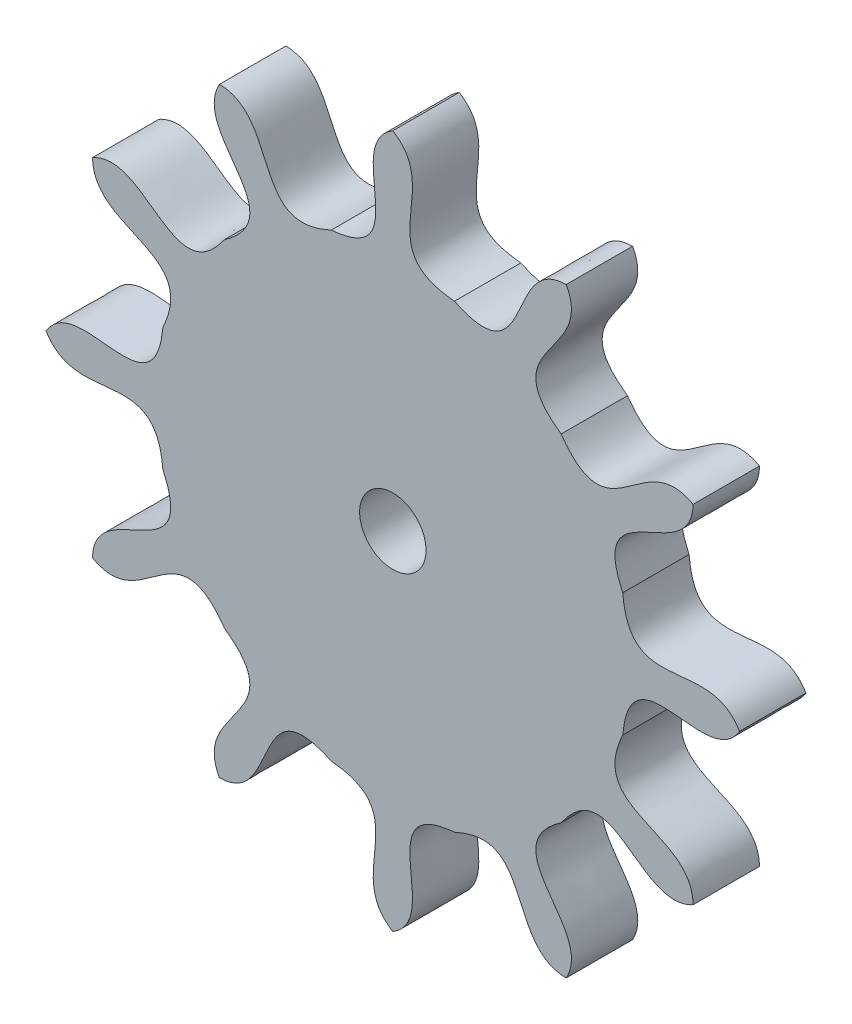
ISO-10303-21;
HEADER;
FILE_DESCRIPTION(('STEP AP214'),'2;1');
FILE_NAME('part.step','',(''),(''),'','','');
FILE_SCHEMA(('AUTOMOTIVE_DESIGN { 1 0 10303 214 1 1 1 1 }'));
ENDSEC;
DATA;
#1=APPLICATION_CONTEXT('core data for automotive mechanical design processes');
#2=APPLICATION_PROTOCOL_DEFINITION('international standard','automotive_design',2000,#1);
#3=PRODUCT_CONTEXT('',#1,'mechanical');
#4=PRODUCT('Part','Part','',(#3));
#5=PRODUCT_RELATED_PRODUCT_CATEGORY('part','',(#4));
#6=PRODUCT_DEFINITION_FORMATION('','',#4);
#7=PRODUCT_DEFINITION_CONTEXT('part definition',#1,'design');
#8=PRODUCT_DEFINITION('design','',#6,#7);
#9=PRODUCT_DEFINITION_SHAPE('','',#8);
#10=(LENGTH_UNIT() NAMED_UNIT(*) SI_UNIT(.MILLI.,.METRE.));
#11=(NAMED_UNIT(*) PLANE_ANGLE_UNIT() SI_UNIT($,.RADIAN.));
#12=(NAMED_UNIT(*) SI_UNIT($,.STERADIAN.) SOLID_ANGLE_UNIT());
#13=UNCERTAINTY_MEASURE_WITH_UNIT(LENGTH_MEASURE(1.E-05),#10,'distance_accuracy_value','');
#14=(GEOMETRIC_REPRESENTATION_CONTEXT(3) GLOBAL_UNCERTAINTY_ASSIGNED_CONTEXT((#13)) GLOBAL_UNIT_ASSIGNED_CONTEXT((#10,
#11,#12)) REPRESENTATION_CONTEXT('',''));
#15=CARTESIAN_POINT('',(0.,0.,0.));
#16=DIRECTION('',(0.,0.,1.));
#17=DIRECTION('',(1.,0.,0.));
#18=AXIS2_PLACEMENT_3D('',#15,#16,#17);
#19=CARTESIAN_POINT('',(0.,26.1243556529821,5.));
#20=CARTESIAN_POINT('',(-3.88486427358941,23.7885822212176,5.));
#21=CARTESIAN_POINT('',(1.91252387629169,17.9039035924904,5.));
#22=CARTESIAN_POINT('',(-4.64125631665174,17.3214043846944,5.));
#23=B_SPLINE_CURVE_WITH_KNOTS('',3,(#19,#20,#21,#22),.UNSPECIFIED.,.F.,.F.,(4,4),(0.,1.),.UNSPECIFIED.);
#24=DIRECTION('',(0.,0.,-1.));
#25=VECTOR('',#24,1.);
#26=SURFACE_OF_LINEAR_EXTRUSION('',#23,#25);
#27=CARTESIAN_POINT('',(0.,26.1243556529821,0.));
#28=CARTESIAN_POINT('',(-3.88486427358941,23.7885822212176,0.));
#29=CARTESIAN_POINT('',(1.91252387629169,17.9039035924904,0.));
#30=CARTESIAN_POINT('',(-4.64125631665174,17.3214043846944,0.));
#31=B_SPLINE_CURVE_WITH_KNOTS('',3,(#27,#28,#29,#30),.UNSPECIFIED.,.F.,.F.,(4,4),(0.,1.),.UNSPECIFIED.);
#32=CARTESIAN_POINT('',(0.,26.1243556529821,0.));
#33=VERTEX_POINT('',#32);
#34=CARTESIAN_POINT('',(-4.64125631665174,17.3214043846944,0.));
#35=VERTEX_POINT('',#34);
#36=EDGE_CURVE('E468',#33,#35,#31,.T.);
#37=ORIENTED_EDGE('',*,*,#36,.T.);
#38=DIRECTION('',(0.,0.,-1.));
#39=VECTOR('',#38,1.);
#40=CARTESIAN_POINT('',(-4.64125631665174,17.3214043846944,5.));
#41=LINE('',#40,#39);
#42=CARTESIAN_POINT('',(-4.64125631665174,17.3214043846944,5.));
#43=VERTEX_POINT('',#42);
#44=EDGE_CURVE('E11',#43,#35,#41,.T.);
#45=ORIENTED_EDGE('',*,*,#44,.F.);
#46=CARTESIAN_POINT('',(0.,26.1243556529821,5.));
#47=VERTEX_POINT('',#46);
#48=EDGE_CURVE('E626',#47,#43,#23,.T.);
#49=ORIENTED_EDGE('',*,*,#48,.F.);
#50=DIRECTION('',(0.,0.,-1.));
#51=VECTOR('',#50,1.);
#52=CARTESIAN_POINT('',(0.,26.1243556529821,5.));
#53=LINE('',#52,#51);
#54=EDGE_CURVE('E222',#47,#33,#53,.T.);
#55=ORIENTED_EDGE('',*,*,#54,.T.);
#56=EDGE_LOOP('',(#37,#45,#49,#55));
#57=FACE_BOUND('',#56,.T.);
#58=ADVANCED_FACE('F33',(#57),#26,.F.);
#59=CARTESIAN_POINT('',(-4.64125631665174,17.3214043846944,5.));
#60=CARTESIAN_POINT('',(-10.6082460584579,14.5489733998586,5.));
#61=CARTESIAN_POINT('',(-8.52989995942556,22.5439486603841,5.));
#62=CARTESIAN_POINT('',(-13.0621778264908,22.6243556529823,5.));
#63=B_SPLINE_CURVE_WITH_KNOTS('',3,(#59,#60,#61,#62),.UNSPECIFIED.,.F.,.F.,(4,4),(0.,1.),.UNSPECIFIED.);
#64=DIRECTION('',(0.,0.,-1.));
#65=VECTOR('',#64,1.);
#66=SURFACE_OF_LINEAR_EXTRUSION('',#63,#65);
#67=CARTESIAN_POINT('',(-4.64125631665174,17.3214043846944,0.));
#68=CARTESIAN_POINT('',(-10.6082460584579,14.5489733998586,0.));
#69=CARTESIAN_POINT('',(-8.52989995942556,22.5439486603841,0.));
#70=CARTESIAN_POINT('',(-13.0621778264908,22.6243556529823,0.));
#71=B_SPLINE_CURVE_WITH_KNOTS('',3,(#67,#68,#69,#70),.UNSPECIFIED.,.F.,.F.,(4,4),(0.,1.),.UNSPECIFIED.);
#72=CARTESIAN_POINT('',(-13.0621778264908,22.6243556529823,0.));
#73=VERTEX_POINT('',#72);
#74=EDGE_CURVE('E459',#35,#73,#71,.T.);
#75=ORIENTED_EDGE('',*,*,#74,.T.);
#76=DIRECTION('',(0.,0.,-1.));
#77=VECTOR('',#76,1.);
#78=CARTESIAN_POINT('',(-13.0621778264908,22.6243556529823,5.));
#79=LINE('',#78,#77);
#80=CARTESIAN_POINT('',(-13.0621778264908,22.6243556529823,5.));
#81=VERTEX_POINT('',#80);
#82=EDGE_CURVE('E42',#81,#73,#79,.T.);
#83=ORIENTED_EDGE('',*,*,#82,.F.);
#84=EDGE_CURVE('E141',#43,#81,#63,.T.);
#85=ORIENTED_EDGE('',*,*,#84,.F.);
#86=ORIENTED_EDGE('',*,*,#44,.T.);
#87=EDGE_LOOP('',(#75,#83,#85,#86));
#88=FACE_BOUND('',#87,.T.);
#89=ADVANCED_FACE('F452',(#88),#66,.F.);
#90=CARTESIAN_POINT('',(-13.0621778264908,22.6243556529823,5.));
#91=CARTESIAN_POINT('',(-15.2586822617916,18.6590843867948,5.));
#92=CARTESIAN_POINT('',(-7.29565753403201,16.46149727615,5.));
#93=CARTESIAN_POINT('',(-12.6801480680425,12.6801480680427,5.));
#94=B_SPLINE_CURVE_WITH_KNOTS('',3,(#90,#91,#92,#93),.UNSPECIFIED.,.F.,.F.,(4,4),(0.,1.),.UNSPECIFIED.);
#95=DIRECTION('',(0.,0.,-1.));
#96=VECTOR('',#95,1.);
#97=SURFACE_OF_LINEAR_EXTRUSION('',#94,#96);
#98=CARTESIAN_POINT('',(-13.0621778264908,22.6243556529823,0.));
#99=CARTESIAN_POINT('',(-15.2586822617916,18.6590843867948,0.));
#100=CARTESIAN_POINT('',(-7.29565753403201,16.46149727615,0.));
#101=CARTESIAN_POINT('',(-12.6801480680425,12.6801480680427,0.));
#102=B_SPLINE_CURVE_WITH_KNOTS('',3,(#98,#99,#100,#101),.UNSPECIFIED.,.F.,.F.,(4,4),(0.,1.),.UNSPECIFIED.);
#103=CARTESIAN_POINT('',(-12.6801480680425,12.6801480680427,0.));
#104=VERTEX_POINT('',#103);
#105=EDGE_CURVE('E467',#73,#104,#102,.T.);
#106=ORIENTED_EDGE('',*,*,#105,.T.);
#107=DIRECTION('',(0.,0.,-1.));
#108=VECTOR('',#107,1.);
#109=CARTESIAN_POINT('',(-12.6801480680425,12.6801480680427,5.));
#110=LINE('',#109,#108);
#111=CARTESIAN_POINT('',(-12.6801480680425,12.6801480680427,5.));
#112=VERTEX_POINT('',#111);
#113=EDGE_CURVE('E472',#112,#104,#110,.T.);
#114=ORIENTED_EDGE('',*,*,#113,.F.);
#115=EDGE_CURVE('E436',#81,#112,#94,.T.);
#116=ORIENTED_EDGE('',*,*,#115,.F.);
#117=ORIENTED_EDGE('',*,*,#82,.T.);
#118=EDGE_LOOP('',(#106,#114,#116,#117));
#119=FACE_BOUND('',#118,.T.);
#120=ADVANCED_FACE('F450',(#119),#97,.F.);
#121=CARTESIAN_POINT('',(-12.6801480680425,12.6801480680427,5.));
#122=CARTESIAN_POINT('',(-16.4614972761499,7.29565753403248,5.));
#123=CARTESIAN_POINT('',(-18.6590843867944,15.258682261792,5.));
#124=CARTESIAN_POINT('',(-22.624355652982,13.0621778264913,5.));
#125=B_SPLINE_CURVE_WITH_KNOTS('',3,(#121,#122,#123,#124),.UNSPECIFIED.,.F.,.F.,(4,4),(0.,1.),.UNSPECIFIED.);
#126=DIRECTION('',(0.,0.,-1.));
#127=VECTOR('',#126,1.);
#128=SURFACE_OF_LINEAR_EXTRUSION('',#125,#127);
#129=CARTESIAN_POINT('',(-12.6801480680425,12.6801480680427,0.));
#130=CARTESIAN_POINT('',(-16.4614972761499,7.29565753403248,0.));
#131=CARTESIAN_POINT('',(-18.6590843867944,15.258682261792,0.));
#132=CARTESIAN_POINT('',(-22.624355652982,13.0621778264913,0.));
#133=B_SPLINE_CURVE_WITH_KNOTS('',3,(#129,#130,#131,#132),.UNSPECIFIED.,.F.,.F.,(4,4),(0.,1.),.UNSPECIFIED.);
#134=CARTESIAN_POINT('',(-22.624355652982,13.0621778264913,0.));
#135=VERTEX_POINT('',#134);
#136=EDGE_CURVE('E476',#104,#135,#133,.T.);
#137=ORIENTED_EDGE('',*,*,#136,.T.);
#138=DIRECTION('',(0.,0.,-1.));
#139=VECTOR('',#138,1.);
#140=CARTESIAN_POINT('',(-22.624355652982,13.0621778264913,5.));
#141=LINE('',#140,#139);
#142=CARTESIAN_POINT('',(-22.624355652982,13.0621778264913,5.));
#143=VERTEX_POINT('',#142);
#144=EDGE_CURVE('E681',#143,#135,#141,.T.);
#145=ORIENTED_EDGE('',*,*,#144,.F.);
#146=EDGE_CURVE('E428',#112,#143,#125,.T.);
#147=ORIENTED_EDGE('',*,*,#146,.F.);
#148=ORIENTED_EDGE('',*,*,#113,.T.);
#149=EDGE_LOOP('',(#137,#145,#147,#148));
#150=FACE_BOUND('',#149,.T.);
#151=ADVANCED_FACE('F420',(#150),#128,.F.);
#152=CARTESIAN_POINT('',(-22.624355652982,13.0621778264913,5.));
#153=CARTESIAN_POINT('',(-22.5439486603839,8.52989995942604,5.));
#154=CARTESIAN_POINT('',(-14.5489733998581,10.6082460584582,5.));
#155=CARTESIAN_POINT('',(-17.3214043846943,4.64125631665192,5.));
#156=B_SPLINE_CURVE_WITH_KNOTS('',3,(#152,#153,#154,#155),.UNSPECIFIED.,.F.,.F.,(4,4),(0.,1.),.UNSPECIFIED.);
#157=DIRECTION('',(0.,0.,-1.));
#158=VECTOR('',#157,1.);
#159=SURFACE_OF_LINEAR_EXTRUSION('',#156,#158);
#160=CARTESIAN_POINT('',(-22.624355652982,13.0621778264913,0.));
#161=CARTESIAN_POINT('',(-22.5439486603839,8.52989995942604,0.));
#162=CARTESIAN_POINT('',(-14.5489733998581,10.6082460584582,0.));
#163=CARTESIAN_POINT('',(-17.3214043846943,4.64125631665192,0.));
#164=B_SPLINE_CURVE_WITH_KNOTS('',3,(#160,#161,#162,#163),.UNSPECIFIED.,.F.,.F.,(4,4),(0.,1.),.UNSPECIFIED.);
#165=CARTESIAN_POINT('',(-17.3214043846943,4.64125631665192,0.));
#166=VERTEX_POINT('',#165);
#167=EDGE_CURVE('E478',#135,#166,#164,.T.);
#168=ORIENTED_EDGE('',*,*,#167,.T.);
#169=DIRECTION('',(0.,0.,-1.));
#170=VECTOR('',#169,1.);
#171=CARTESIAN_POINT('',(-17.3214043846943,4.64125631665192,5.));
#172=LINE('',#171,#170);
#173=CARTESIAN_POINT('',(-17.3214043846943,4.64125631665192,5.));
#174=VERTEX_POINT('',#173);
#175=EDGE_CURVE('E678',#174,#166,#172,.T.);
#176=ORIENTED_EDGE('',*,*,#175,.F.);
#177=EDGE_CURVE('E424',#143,#174,#156,.T.);
#178=ORIENTED_EDGE('',*,*,#177,.F.);
#179=ORIENTED_EDGE('',*,*,#144,.T.);
#180=EDGE_LOOP('',(#168,#176,#178,#179));
#181=FACE_BOUND('',#180,.T.);
#182=ADVANCED_FACE('F416',(#181),#159,.F.);
#183=CARTESIAN_POINT('',(-17.3214043846943,4.64125631665192,5.));
#184=CARTESIAN_POINT('',(-17.9039035924904,-1.91252387629151,5.));
#185=CARTESIAN_POINT('',(-23.7885822212176,3.88486427358966,5.));
#186=CARTESIAN_POINT('',(-26.1243556529821,2.71903377279088E-13,5.));
#187=B_SPLINE_CURVE_WITH_KNOTS('',3,(#183,#184,#185,#186),.UNSPECIFIED.,.F.,.F.,(4,4),(0.,1.),.UNSPECIFIED.);
#188=DIRECTION('',(0.,0.,-1.));
#189=VECTOR('',#188,1.);
#190=SURFACE_OF_LINEAR_EXTRUSION('',#187,#189);
#191=CARTESIAN_POINT('',(-17.3214043846943,4.64125631665192,0.));
#192=CARTESIAN_POINT('',(-17.9039035924904,-1.91252387629151,0.));
#193=CARTESIAN_POINT('',(-23.7885822212176,3.88486427358966,0.));
#194=CARTESIAN_POINT('',(-26.1243556529821,2.71903377279088E-13,0.));
#195=B_SPLINE_CURVE_WITH_KNOTS('',3,(#191,#192,#193,#194),.UNSPECIFIED.,.F.,.F.,(4,4),(0.,1.),.UNSPECIFIED.);
#196=CARTESIAN_POINT('',(-26.1243556529821,2.71903377279088E-13,0.));
#197=VERTEX_POINT('',#196);
#198=EDGE_CURVE('E496',#166,#197,#195,.T.);
#199=ORIENTED_EDGE('',*,*,#198,.T.);
#200=DIRECTION('',(0.,0.,-1.));
#201=VECTOR('',#200,1.);
#202=CARTESIAN_POINT('',(-26.1243556529821,2.71903377279088E-13,5.));
#203=LINE('',#202,#201);
#204=CARTESIAN_POINT('',(-26.1243556529821,2.71903377279088E-13,5.));
#205=VERTEX_POINT('',#204);
#206=EDGE_CURVE('E675',#205,#197,#203,.T.);
#207=ORIENTED_EDGE('',*,*,#206,.F.);
#208=EDGE_CURVE('E401',#174,#205,#187,.T.);
#209=ORIENTED_EDGE('',*,*,#208,.F.);
#210=ORIENTED_EDGE('',*,*,#175,.T.);
#211=EDGE_LOOP('',(#199,#207,#209,#210));
#212=FACE_BOUND('',#211,.T.);
#213=ADVANCED_FACE('F412',(#212),#190,.F.);
#214=CARTESIAN_POINT('',(-26.1243556529821,2.71903377279088E-13,5.));
#215=CARTESIAN_POINT('',(-23.7885822212176,-3.88486427358918,5.));
#216=CARTESIAN_POINT('',(-17.9039035924903,1.91252387629192,5.));
#217=CARTESIAN_POINT('',(-17.3214043846944,-4.64125631665163,5.));
#218=B_SPLINE_CURVE_WITH_KNOTS('',3,(#214,#215,#216,#217),.UNSPECIFIED.,.F.,.F.,(4,4),(0.,1.),.UNSPECIFIED.);
#219=DIRECTION('',(0.,0.,-1.));
#220=VECTOR('',#219,1.);
#221=SURFACE_OF_LINEAR_EXTRUSION('',#218,#220);
#222=CARTESIAN_POINT('',(-26.1243556529821,2.71903377279088E-13,0.));
#223=CARTESIAN_POINT('',(-23.7885822212176,-3.88486427358918,0.));
#224=CARTESIAN_POINT('',(-17.9039035924903,1.91252387629192,0.));
#225=CARTESIAN_POINT('',(-17.3214043846944,-4.64125631665163,0.));
#226=B_SPLINE_CURVE_WITH_KNOTS('',3,(#222,#223,#224,#225),.UNSPECIFIED.,.F.,.F.,(4,4),(0.,1.),.UNSPECIFIED.);
#227=CARTESIAN_POINT('',(-17.3214043846944,-4.64125631665163,0.));
#228=VERTEX_POINT('',#227);
#229=EDGE_CURVE('E503',#197,#228,#226,.T.);
#230=ORIENTED_EDGE('',*,*,#229,.T.);
#231=DIRECTION('',(0.,0.,-1.));
#232=VECTOR('',#231,1.);
#233=CARTESIAN_POINT('',(-17.3214043846944,-4.64125631665163,5.));
#234=LINE('',#233,#232);
#235=CARTESIAN_POINT('',(-17.3214043846944,-4.64125631665163,5.));
#236=VERTEX_POINT('',#235);
#237=EDGE_CURVE('E672',#236,#228,#234,.T.);
#238=ORIENTED_EDGE('',*,*,#237,.F.);
#239=EDGE_CURVE('E393',#205,#236,#218,.T.);
#240=ORIENTED_EDGE('',*,*,#239,.F.);
#241=ORIENTED_EDGE('',*,*,#206,.T.);
#242=EDGE_LOOP('',(#230,#238,#240,#241));
#243=FACE_BOUND('',#242,.T.);
#244=ADVANCED_FACE('F409',(#243),#221,.F.);
#245=CARTESIAN_POINT('',(-17.3214043846944,-4.64125631665163,5.));
#246=CARTESIAN_POINT('',(-14.5489733998584,-10.6082460584579,5.));
#247=CARTESIAN_POINT('',(-22.5439486603841,-8.52989995942559,5.));
#248=CARTESIAN_POINT('',(-22.6243556529823,-13.0621778264909,5.));
#249=B_SPLINE_CURVE_WITH_KNOTS('',3,(#245,#246,#247,#248),.UNSPECIFIED.,.F.,.F.,(4,4),(0.,1.),.UNSPECIFIED.);
#250=DIRECTION('',(0.,0.,-1.));
#251=VECTOR('',#250,1.);
#252=SURFACE_OF_LINEAR_EXTRUSION('',#249,#251);
#253=CARTESIAN_POINT('',(-17.3214043846944,-4.64125631665163,0.));
#254=CARTESIAN_POINT('',(-14.5489733998584,-10.6082460584579,0.));
#255=CARTESIAN_POINT('',(-22.5439486603841,-8.52989995942559,0.));
#256=CARTESIAN_POINT('',(-22.6243556529823,-13.0621778264909,0.));
#257=B_SPLINE_CURVE_WITH_KNOTS('',3,(#253,#254,#255,#256),.UNSPECIFIED.,.F.,.F.,(4,4),(0.,1.),.UNSPECIFIED.);
#258=CARTESIAN_POINT('',(-22.6243556529823,-13.0621778264909,0.));
#259=VERTEX_POINT('',#258);
#260=EDGE_CURVE('E510',#228,#259,#257,.T.);
#261=ORIENTED_EDGE('',*,*,#260,.T.);
#262=DIRECTION('',(0.,0.,-1.));
#263=VECTOR('',#262,1.);
#264=CARTESIAN_POINT('',(-22.6243556529823,-13.0621778264909,5.));
#265=LINE('',#264,#263);
#266=CARTESIAN_POINT('',(-22.6243556529823,-13.0621778264909,5.));
#267=VERTEX_POINT('',#266);
#268=EDGE_CURVE('E669',#267,#259,#265,.T.);
#269=ORIENTED_EDGE('',*,*,#268,.F.);
#270=EDGE_CURVE('E385',#236,#267,#249,.T.);
#271=ORIENTED_EDGE('',*,*,#270,.F.);
#272=ORIENTED_EDGE('',*,*,#237,.T.);
#273=EDGE_LOOP('',(#261,#269,#271,#272));
#274=FACE_BOUND('',#273,.T.);
#275=ADVANCED_FACE('F377',(#274),#252,.F.);
#276=CARTESIAN_POINT('',(-22.6243556529823,-13.0621778264909,5.));
#277=CARTESIAN_POINT('',(-18.6590843867947,-15.2586822617917,5.));
#278=CARTESIAN_POINT('',(-16.46149727615,-7.29565753403206,5.));
#279=CARTESIAN_POINT('',(-12.6801480680427,-12.6801480680425,5.));
#280=B_SPLINE_CURVE_WITH_KNOTS('',3,(#276,#277,#278,#279),.UNSPECIFIED.,.F.,.F.,(4,4),(0.,1.),.UNSPECIFIED.);
#281=DIRECTION('',(0.,0.,-1.));
#282=VECTOR('',#281,1.);
#283=SURFACE_OF_LINEAR_EXTRUSION('',#280,#282);
#284=CARTESIAN_POINT('',(-22.6243556529823,-13.0621778264909,0.));
#285=CARTESIAN_POINT('',(-18.6590843867947,-15.2586822617917,0.));
#286=CARTESIAN_POINT('',(-16.46149727615,-7.29565753403206,0.));
#287=CARTESIAN_POINT('',(-12.6801480680427,-12.6801480680425,0.));
#288=B_SPLINE_CURVE_WITH_KNOTS('',3,(#284,#285,#286,#287),.UNSPECIFIED.,.F.,.F.,(4,4),(0.,1.),.UNSPECIFIED.);
#289=CARTESIAN_POINT('',(-12.6801480680427,-12.6801480680425,0.));
#290=VERTEX_POINT('',#289);
#291=EDGE_CURVE('E517',#259,#290,#288,.T.);
#292=ORIENTED_EDGE('',*,*,#291,.T.);
#293=DIRECTION('',(0.,0.,-1.));
#294=VECTOR('',#293,1.);
#295=CARTESIAN_POINT('',(-12.6801480680427,-12.6801480680425,5.));
#296=LINE('',#295,#294);
#297=CARTESIAN_POINT('',(-12.6801480680427,-12.6801480680425,5.));
#298=VERTEX_POINT('',#297);
#299=EDGE_CURVE('E666',#298,#290,#296,.T.);
#300=ORIENTED_EDGE('',*,*,#299,.F.);
#301=EDGE_CURVE('E381',#267,#298,#280,.T.);
#302=ORIENTED_EDGE('',*,*,#301,.F.);
#303=ORIENTED_EDGE('',*,*,#268,.T.);
#304=EDGE_LOOP('',(#292,#300,#302,#303));
#305=FACE_BOUND('',#304,.T.);
#306=ADVANCED_FACE('F373',(#305),#283,.F.);
#307=CARTESIAN_POINT('',(-12.6801480680427,-12.6801480680425,5.));
#308=CARTESIAN_POINT('',(-7.29565753403242,-16.4614972761499,5.));
#309=CARTESIAN_POINT('',(-15.258682261792,-18.6590843867945,5.));
#310=CARTESIAN_POINT('',(-13.0621778264913,-22.624355652982,5.));
#311=B_SPLINE_CURVE_WITH_KNOTS('',3,(#307,#308,#309,#310),.UNSPECIFIED.,.F.,.F.,(4,4),(0.,1.),.UNSPECIFIED.);
#312=DIRECTION('',(0.,0.,-1.));
#313=VECTOR('',#312,1.);
#314=SURFACE_OF_LINEAR_EXTRUSION('',#311,#313);
#315=CARTESIAN_POINT('',(-12.6801480680427,-12.6801480680425,0.));
#316=CARTESIAN_POINT('',(-7.29565753403242,-16.4614972761499,0.));
#317=CARTESIAN_POINT('',(-15.258682261792,-18.6590843867945,0.));
#318=CARTESIAN_POINT('',(-13.0621778264913,-22.624355652982,0.));
#319=B_SPLINE_CURVE_WITH_KNOTS('',3,(#315,#316,#317,#318),.UNSPECIFIED.,.F.,.F.,(4,4),(0.,1.),.UNSPECIFIED.);
#320=CARTESIAN_POINT('',(-13.0621778264913,-22.624355652982,0.));
#321=VERTEX_POINT('',#320);
#322=EDGE_CURVE('E524',#290,#321,#319,.T.);
#323=ORIENTED_EDGE('',*,*,#322,.T.);
#324=DIRECTION('',(0.,0.,-1.));
#325=VECTOR('',#324,1.);
#326=CARTESIAN_POINT('',(-13.0621778264913,-22.624355652982,5.));
#327=LINE('',#326,#325);
#328=CARTESIAN_POINT('',(-13.0621778264913,-22.624355652982,5.));
#329=VERTEX_POINT('',#328);
#330=EDGE_CURVE('E663',#329,#321,#327,.T.);
#331=ORIENTED_EDGE('',*,*,#330,.F.);
#332=EDGE_CURVE('E358',#298,#329,#311,.T.);
#333=ORIENTED_EDGE('',*,*,#332,.F.);
#334=ORIENTED_EDGE('',*,*,#299,.T.);
#335=EDGE_LOOP('',(#323,#331,#333,#334));
#336=FACE_BOUND('',#335,.T.);
#337=ADVANCED_FACE('F369',(#336),#314,.F.);
#338=CARTESIAN_POINT('',(-13.0621778264913,-22.624355652982,5.));
#339=CARTESIAN_POINT('',(-8.52989995942596,-22.5439486603839,5.));
#340=CARTESIAN_POINT('',(-10.6082460584582,-14.5489733998581,5.));
#341=CARTESIAN_POINT('',(-4.64125631665186,-17.3214043846944,5.));
#342=B_SPLINE_CURVE_WITH_KNOTS('',3,(#338,#339,#340,#341),.UNSPECIFIED.,.F.,.F.,(4,4),(0.,1.),.UNSPECIFIED.);
#343=DIRECTION('',(0.,0.,-1.));
#344=VECTOR('',#343,1.);
#345=SURFACE_OF_LINEAR_EXTRUSION('',#342,#344);
#346=CARTESIAN_POINT('',(-13.0621778264913,-22.624355652982,0.));
#347=CARTESIAN_POINT('',(-8.52989995942596,-22.5439486603839,0.));
#348=CARTESIAN_POINT('',(-10.6082460584582,-14.5489733998581,0.));
#349=CARTESIAN_POINT('',(-4.64125631665186,-17.3214043846944,0.));
#350=B_SPLINE_CURVE_WITH_KNOTS('',3,(#346,#347,#348,#349),.UNSPECIFIED.,.F.,.F.,(4,4),(0.,1.),.UNSPECIFIED.);
#351=CARTESIAN_POINT('',(-4.64125631665186,-17.3214043846944,0.));
#352=VERTEX_POINT('',#351);
#353=EDGE_CURVE('E531',#321,#352,#350,.T.);
#354=ORIENTED_EDGE('',*,*,#353,.T.);
#355=DIRECTION('',(0.,0.,-1.));
#356=VECTOR('',#355,1.);
#357=CARTESIAN_POINT('',(-4.64125631665186,-17.3214043846944,5.));
#358=LINE('',#357,#356);
#359=CARTESIAN_POINT('',(-4.64125631665186,-17.3214043846944,5.));
#360=VERTEX_POINT('',#359);
#361=EDGE_CURVE('E660',#360,#352,#358,.T.);
#362=ORIENTED_EDGE('',*,*,#361,.F.);
#363=EDGE_CURVE('E350',#329,#360,#342,.T.);
#364=ORIENTED_EDGE('',*,*,#363,.F.);
#365=ORIENTED_EDGE('',*,*,#330,.T.);
#366=EDGE_LOOP('',(#354,#362,#364,#365));
#367=FACE_BOUND('',#366,.T.);
#368=ADVANCED_FACE('F366',(#367),#345,.F.);
#369=CARTESIAN_POINT('',(-4.64125631665186,-17.3214043846944,5.));
#370=CARTESIAN_POINT('',(1.91252387629157,-17.9039035924904,5.));
#371=CARTESIAN_POINT('',(-3.88486427358958,-23.7885822212176,5.));
#372=CARTESIAN_POINT('',(-1.806906770274E-13,-26.1243556529821,5.));
#373=B_SPLINE_CURVE_WITH_KNOTS('',3,(#369,#370,#371,#372),.UNSPECIFIED.,.F.,.F.,(4,4),(0.,1.),.UNSPECIFIED.);
#374=DIRECTION('',(0.,0.,-1.));
#375=VECTOR('',#374,1.);
#376=SURFACE_OF_LINEAR_EXTRUSION('',#373,#375);
#377=CARTESIAN_POINT('',(-4.64125631665186,-17.3214043846944,0.));
#378=CARTESIAN_POINT('',(1.91252387629157,-17.9039035924904,0.));
#379=CARTESIAN_POINT('',(-3.88486427358958,-23.7885822212176,0.));
#380=CARTESIAN_POINT('',(-1.806906770274E-13,-26.1243556529821,0.));
#381=B_SPLINE_CURVE_WITH_KNOTS('',3,(#377,#378,#379,#380),.UNSPECIFIED.,.F.,.F.,(4,4),(0.,1.),.UNSPECIFIED.);
#382=CARTESIAN_POINT('',(-1.806906770274E-13,-26.1243556529821,0.));
#383=VERTEX_POINT('',#382);
#384=EDGE_CURVE('E538',#352,#383,#381,.T.);
#385=ORIENTED_EDGE('',*,*,#384,.T.);
#386=DIRECTION('',(0.,0.,-1.));
#387=VECTOR('',#386,1.);
#388=CARTESIAN_POINT('',(-1.806906770274E-13,-26.1243556529821,5.));
#389=LINE('',#388,#387);
#390=CARTESIAN_POINT('',(-1.806906770274E-13,-26.1243556529821,5.));
#391=VERTEX_POINT('',#390);
#392=EDGE_CURVE('E657',#391,#383,#389,.T.);
#393=ORIENTED_EDGE('',*,*,#392,.F.);
#394=EDGE_CURVE('E342',#360,#391,#373,.T.);
#395=ORIENTED_EDGE('',*,*,#394,.F.);
#396=ORIENTED_EDGE('',*,*,#361,.T.);
#397=EDGE_LOOP('',(#385,#393,#395,#396));
#398=FACE_BOUND('',#397,.T.);
#399=ADVANCED_FACE('F334',(#398),#376,.F.);
#400=CARTESIAN_POINT('',(-1.806906770274E-13,-26.1243556529821,5.));
#401=CARTESIAN_POINT('',(3.88486427358926,-23.7885822212176,5.));
#402=CARTESIAN_POINT('',(-1.91252387629186,-17.9039035924903,5.));
#403=CARTESIAN_POINT('',(4.64125631665169,-17.3214043846944,5.));
#404=B_SPLINE_CURVE_WITH_KNOTS('',3,(#400,#401,#402,#403),.UNSPECIFIED.,.F.,.F.,(4,4),(0.,1.),.UNSPECIFIED.);
#405=DIRECTION('',(0.,0.,-1.));
#406=VECTOR('',#405,1.);
#407=SURFACE_OF_LINEAR_EXTRUSION('',#404,#406);
#408=CARTESIAN_POINT('',(-1.806906770274E-13,-26.1243556529821,0.));
#409=CARTESIAN_POINT('',(3.88486427358926,-23.7885822212176,0.));
#410=CARTESIAN_POINT('',(-1.91252387629186,-17.9039035924903,0.));
#411=CARTESIAN_POINT('',(4.64125631665169,-17.3214043846944,0.));
#412=B_SPLINE_CURVE_WITH_KNOTS('',3,(#408,#409,#410,#411),.UNSPECIFIED.,.F.,.F.,(4,4),(0.,1.),.UNSPECIFIED.);
#413=CARTESIAN_POINT('',(4.64125631665169,-17.3214043846944,0.));
#414=VERTEX_POINT('',#413);
#415=EDGE_CURVE('E545',#383,#414,#412,.T.);
#416=ORIENTED_EDGE('',*,*,#415,.T.);
#417=DIRECTION('',(0.,0.,-1.));
#418=VECTOR('',#417,1.);
#419=CARTESIAN_POINT('',(4.64125631665169,-17.3214043846944,5.));
#420=LINE('',#419,#418);
#421=CARTESIAN_POINT('',(4.64125631665169,-17.3214043846944,5.));
#422=VERTEX_POINT('',#421);
#423=EDGE_CURVE('E654',#422,#414,#420,.T.);
#424=ORIENTED_EDGE('',*,*,#423,.F.);
#425=EDGE_CURVE('E338',#391,#422,#404,.T.);
#426=ORIENTED_EDGE('',*,*,#425,.F.);
#427=ORIENTED_EDGE('',*,*,#392,.T.);
#428=EDGE_LOOP('',(#416,#424,#426,#427));
#429=FACE_BOUND('',#428,.T.);
#430=ADVANCED_FACE('F330',(#429),#407,.F.);
#431=CARTESIAN_POINT('',(4.64125631665169,-17.3214043846944,5.));
#432=CARTESIAN_POINT('',(10.608246058458,-14.5489733998584,5.));
#433=CARTESIAN_POINT('',(8.52989995942567,-22.5439486603841,5.));
#434=CARTESIAN_POINT('',(13.0621778264909,-22.6243556529822,5.));
#435=B_SPLINE_CURVE_WITH_KNOTS('',3,(#431,#432,#433,#434),.UNSPECIFIED.,.F.,.F.,(4,4),(0.,1.),.UNSPECIFIED.);
#436=DIRECTION('',(0.,0.,-1.));
#437=VECTOR('',#436,1.);
#438=SURFACE_OF_LINEAR_EXTRUSION('',#435,#437);
#439=CARTESIAN_POINT('',(4.64125631665169,-17.3214043846944,0.));
#440=CARTESIAN_POINT('',(10.608246058458,-14.5489733998584,0.));
#441=CARTESIAN_POINT('',(8.52989995942567,-22.5439486603841,0.));
#442=CARTESIAN_POINT('',(13.0621778264909,-22.6243556529822,0.));
#443=B_SPLINE_CURVE_WITH_KNOTS('',3,(#439,#440,#441,#442),.UNSPECIFIED.,.F.,.F.,(4,4),(0.,1.),.UNSPECIFIED.);
#444=CARTESIAN_POINT('',(13.0621778264909,-22.6243556529822,0.));
#445=VERTEX_POINT('',#444);
#446=EDGE_CURVE('E552',#414,#445,#443,.T.);
#447=ORIENTED_EDGE('',*,*,#446,.T.);
#448=DIRECTION('',(0.,0.,-1.));
#449=VECTOR('',#448,1.);
#450=CARTESIAN_POINT('',(13.0621778264909,-22.6243556529822,5.));
#451=LINE('',#450,#449);
#452=CARTESIAN_POINT('',(13.0621778264909,-22.6243556529822,5.));
#453=VERTEX_POINT('',#452);
#454=EDGE_CURVE('E651',#453,#445,#451,.T.);
#455=ORIENTED_EDGE('',*,*,#454,.F.);
#456=EDGE_CURVE('E315',#422,#453,#435,.T.);
#457=ORIENTED_EDGE('',*,*,#456,.F.);
#458=ORIENTED_EDGE('',*,*,#423,.T.);
#459=EDGE_LOOP('',(#447,#455,#457,#458));
#460=FACE_BOUND('',#459,.T.);
#461=ADVANCED_FACE('F326',(#460),#438,.F.);
#462=CARTESIAN_POINT('',(13.0621778264909,-22.6243556529822,5.));
#463=CARTESIAN_POINT('',(15.2586822617917,-18.6590843867947,5.));
#464=CARTESIAN_POINT('',(7.29565753403212,-16.46149727615,5.));
#465=CARTESIAN_POINT('',(12.6801480680426,-12.6801480680426,5.));
#466=B_SPLINE_CURVE_WITH_KNOTS('',3,(#462,#463,#464,#465),.UNSPECIFIED.,.F.,.F.,(4,4),(0.,1.),.UNSPECIFIED.);
#467=DIRECTION('',(0.,0.,-1.));
#468=VECTOR('',#467,1.);
#469=SURFACE_OF_LINEAR_EXTRUSION('',#466,#468);
#470=CARTESIAN_POINT('',(13.0621778264909,-22.6243556529822,0.));
#471=CARTESIAN_POINT('',(15.2586822617917,-18.6590843867947,0.));
#472=CARTESIAN_POINT('',(7.29565753403212,-16.46149727615,0.));
#473=CARTESIAN_POINT('',(12.6801480680426,-12.6801480680426,0.));
#474=B_SPLINE_CURVE_WITH_KNOTS('',3,(#470,#471,#472,#473),.UNSPECIFIED.,.F.,.F.,(4,4),(0.,1.),.UNSPECIFIED.);
#475=CARTESIAN_POINT('',(12.6801480680426,-12.6801480680426,0.));
#476=VERTEX_POINT('',#475);
#477=EDGE_CURVE('E559',#445,#476,#474,.T.);
#478=ORIENTED_EDGE('',*,*,#477,.T.);
#479=DIRECTION('',(0.,0.,-1.));
#480=VECTOR('',#479,1.);
#481=CARTESIAN_POINT('',(12.6801480680426,-12.6801480680426,5.));
#482=LINE('',#481,#480);
#483=CARTESIAN_POINT('',(12.6801480680426,-12.6801480680426,5.));
#484=VERTEX_POINT('',#483);
#485=EDGE_CURVE('E648',#484,#476,#482,.T.);
#486=ORIENTED_EDGE('',*,*,#485,.F.);
#487=EDGE_CURVE('E307',#453,#484,#466,.T.);
#488=ORIENTED_EDGE('',*,*,#487,.F.);
#489=ORIENTED_EDGE('',*,*,#454,.T.);
#490=EDGE_LOOP('',(#478,#486,#488,#489));
#491=FACE_BOUND('',#490,.T.);
#492=ADVANCED_FACE('F323',(#491),#469,.F.);
#493=CARTESIAN_POINT('',(12.6801480680426,-12.6801480680426,5.));
#494=CARTESIAN_POINT('',(16.4614972761499,-7.29565753403237,5.));
#495=CARTESIAN_POINT('',(18.6590843867945,-15.2586822617919,5.));
#496=CARTESIAN_POINT('',(22.6243556529821,-13.0621778264912,5.));
#497=B_SPLINE_CURVE_WITH_KNOTS('',3,(#493,#494,#495,#496),.UNSPECIFIED.,.F.,.F.,(4,4),(0.,1.),.UNSPECIFIED.);
#498=DIRECTION('',(0.,0.,-1.));
#499=VECTOR('',#498,1.);
#500=SURFACE_OF_LINEAR_EXTRUSION('',#497,#499);
#501=CARTESIAN_POINT('',(12.6801480680426,-12.6801480680426,0.));
#502=CARTESIAN_POINT('',(16.4614972761499,-7.29565753403237,0.));
#503=CARTESIAN_POINT('',(18.6590843867945,-15.2586822617919,0.));
#504=CARTESIAN_POINT('',(22.6243556529821,-13.0621778264912,0.));
#505=B_SPLINE_CURVE_WITH_KNOTS('',3,(#501,#502,#503,#504),.UNSPECIFIED.,.F.,.F.,(4,4),(0.,1.),.UNSPECIFIED.);
#506=CARTESIAN_POINT('',(22.6243556529821,-13.0621778264912,0.));
#507=VERTEX_POINT('',#506);
#508=EDGE_CURVE('E566',#476,#507,#505,.T.);
#509=ORIENTED_EDGE('',*,*,#508,.T.);
#510=DIRECTION('',(0.,0.,-1.));
#511=VECTOR('',#510,1.);
#512=CARTESIAN_POINT('',(22.6243556529821,-13.0621778264912,5.));
#513=LINE('',#512,#511);
#514=CARTESIAN_POINT('',(22.6243556529821,-13.0621778264912,5.));
#515=VERTEX_POINT('',#514);
#516=EDGE_CURVE('E645',#515,#507,#513,.T.);
#517=ORIENTED_EDGE('',*,*,#516,.F.);
#518=EDGE_CURVE('E299',#484,#515,#497,.T.);
#519=ORIENTED_EDGE('',*,*,#518,.F.);
#520=ORIENTED_EDGE('',*,*,#485,.T.);
#521=EDGE_LOOP('',(#509,#517,#519,#520));
#522=FACE_BOUND('',#521,.T.);
#523=ADVANCED_FACE('F291',(#522),#500,.F.);
#524=CARTESIAN_POINT('',(22.6243556529821,-13.0621778264912,5.));
#525=CARTESIAN_POINT('',(22.543948660384,-8.52989995942588,5.));
#526=CARTESIAN_POINT('',(14.5489733998582,-10.6082460584581,5.));
#527=CARTESIAN_POINT('',(17.3214043846944,-4.6412563166518,5.));
#528=B_SPLINE_CURVE_WITH_KNOTS('',3,(#524,#525,#526,#527),.UNSPECIFIED.,.F.,.F.,(4,4),(0.,1.),.UNSPECIFIED.);
#529=DIRECTION('',(0.,0.,-1.));
#530=VECTOR('',#529,1.);
#531=SURFACE_OF_LINEAR_EXTRUSION('',#528,#530);
#532=CARTESIAN_POINT('',(22.6243556529821,-13.0621778264912,0.));
#533=CARTESIAN_POINT('',(22.543948660384,-8.52989995942588,0.));
#534=CARTESIAN_POINT('',(14.5489733998582,-10.6082460584581,0.));
#535=CARTESIAN_POINT('',(17.3214043846944,-4.6412563166518,0.));
#536=B_SPLINE_CURVE_WITH_KNOTS('',3,(#532,#533,#534,#535),.UNSPECIFIED.,.F.,.F.,(4,4),(0.,1.),.UNSPECIFIED.);
#537=CARTESIAN_POINT('',(17.3214043846944,-4.6412563166518,0.));
#538=VERTEX_POINT('',#537);
#539=EDGE_CURVE('E573',#507,#538,#536,.T.);
#540=ORIENTED_EDGE('',*,*,#539,.T.);
#541=DIRECTION('',(0.,0.,-1.));
#542=VECTOR('',#541,1.);
#543=CARTESIAN_POINT('',(17.3214043846944,-4.6412563166518,5.));
#544=LINE('',#543,#542);
#545=CARTESIAN_POINT('',(17.3214043846944,-4.6412563166518,5.));
#546=VERTEX_POINT('',#545);
#547=EDGE_CURVE('E642',#546,#538,#544,.T.);
#548=ORIENTED_EDGE('',*,*,#547,.F.);
#549=EDGE_CURVE('E295',#515,#546,#528,.T.);
#550=ORIENTED_EDGE('',*,*,#549,.F.);
#551=ORIENTED_EDGE('',*,*,#516,.T.);
#552=EDGE_LOOP('',(#540,#548,#550,#551));
#553=FACE_BOUND('',#552,.T.);
#554=ADVANCED_FACE('F287',(#553),#531,.F.);
#555=CARTESIAN_POINT('',(17.3214043846944,-4.6412563166518,5.));
#556=CARTESIAN_POINT('',(17.9039035924904,1.91252387629163,5.));
#557=CARTESIAN_POINT('',(23.7885822212176,-3.88486427358949,5.));
#558=CARTESIAN_POINT('',(26.1243556529821,0.,5.));
#559=B_SPLINE_CURVE_WITH_KNOTS('',3,(#555,#556,#557,#558),.UNSPECIFIED.,.F.,.F.,(4,4),(0.,1.),.UNSPECIFIED.);
#560=DIRECTION('',(0.,0.,-1.));
#561=VECTOR('',#560,1.);
#562=SURFACE_OF_LINEAR_EXTRUSION('',#559,#561);
#563=CARTESIAN_POINT('',(17.3214043846944,-4.6412563166518,0.));
#564=CARTESIAN_POINT('',(17.9039035924904,1.91252387629163,0.));
#565=CARTESIAN_POINT('',(23.7885822212176,-3.88486427358949,0.));
#566=CARTESIAN_POINT('',(26.1243556529821,0.,0.));
#567=B_SPLINE_CURVE_WITH_KNOTS('',3,(#563,#564,#565,#566),.UNSPECIFIED.,.F.,.F.,(4,4),(0.,1.),.UNSPECIFIED.);
#568=CARTESIAN_POINT('',(26.1243556529821,0.,0.));
#569=VERTEX_POINT('',#568);
#570=EDGE_CURVE('E580',#538,#569,#567,.T.);
#571=ORIENTED_EDGE('',*,*,#570,.T.);
#572=DIRECTION('',(0.,0.,-1.));
#573=VECTOR('',#572,1.);
#574=CARTESIAN_POINT('',(26.1243556529821,0.,5.));
#575=LINE('',#574,#573);
#576=CARTESIAN_POINT('',(26.1243556529821,0.,5.));
#577=VERTEX_POINT('',#576);
#578=EDGE_CURVE('E639',#577,#569,#575,.T.);
#579=ORIENTED_EDGE('',*,*,#578,.F.);
#580=EDGE_CURVE('E272',#546,#577,#559,.T.);
#581=ORIENTED_EDGE('',*,*,#580,.F.);
#582=ORIENTED_EDGE('',*,*,#547,.T.);
#583=EDGE_LOOP('',(#571,#579,#581,#582));
#584=FACE_BOUND('',#583,.T.);
#585=ADVANCED_FACE('F283',(#584),#562,.F.);
#586=CARTESIAN_POINT('',(26.1243556529821,0.,5.));
#587=CARTESIAN_POINT('',(23.7885822212176,3.88486427358935,5.));
#588=CARTESIAN_POINT('',(17.9039035924903,-1.91252387629179,5.));
#589=CARTESIAN_POINT('',(17.3214043846944,4.64125631665176,5.));
#590=B_SPLINE_CURVE_WITH_KNOTS('',3,(#586,#587,#588,#589),.UNSPECIFIED.,.F.,.F.,(4,4),(0.,1.),.UNSPECIFIED.);
#591=DIRECTION('',(0.,0.,-1.));
#592=VECTOR('',#591,1.);
#593=SURFACE_OF_LINEAR_EXTRUSION('',#590,#592);
#594=CARTESIAN_POINT('',(26.1243556529821,0.,0.));
#595=CARTESIAN_POINT('',(23.7885822212176,3.88486427358935,0.));
#596=CARTESIAN_POINT('',(17.9039035924903,-1.91252387629179,0.));
#597=CARTESIAN_POINT('',(17.3214043846944,4.64125631665176,0.));
#598=B_SPLINE_CURVE_WITH_KNOTS('',3,(#594,#595,#596,#597),.UNSPECIFIED.,.F.,.F.,(4,4),(0.,1.),.UNSPECIFIED.);
#599=CARTESIAN_POINT('',(17.3214043846944,4.64125631665175,0.));
#600=VERTEX_POINT('',#599);
#601=EDGE_CURVE('E587',#569,#600,#598,.T.);
#602=ORIENTED_EDGE('',*,*,#601,.T.);
#603=DIRECTION('',(0.,0.,-1.));
#604=VECTOR('',#603,1.);
#605=CARTESIAN_POINT('',(17.3214043846944,4.64125631665175,5.));
#606=LINE('',#605,#604);
#607=CARTESIAN_POINT('',(17.3214043846944,4.64125631665175,5.));
#608=VERTEX_POINT('',#607);
#609=EDGE_CURVE('E636',#608,#600,#606,.T.);
#610=ORIENTED_EDGE('',*,*,#609,.F.);
#611=EDGE_CURVE('E264',#577,#608,#590,.T.);
#612=ORIENTED_EDGE('',*,*,#611,.F.);
#613=ORIENTED_EDGE('',*,*,#578,.T.);
#614=EDGE_LOOP('',(#602,#610,#612,#613));
#615=FACE_BOUND('',#614,.T.);
#616=ADVANCED_FACE('F280',(#615),#593,.F.);
#617=CARTESIAN_POINT('',(17.3214043846944,4.64125631665175,5.));
#618=CARTESIAN_POINT('',(14.5489733998583,10.608246058458,5.));
#619=CARTESIAN_POINT('',(22.543948660384,8.52989995942575,5.));
#620=CARTESIAN_POINT('',(22.6243556529822,13.062177826491,5.));
#621=B_SPLINE_CURVE_WITH_KNOTS('',3,(#617,#618,#619,#620),.UNSPECIFIED.,.F.,.F.,(4,4),(0.,1.),.UNSPECIFIED.);
#622=DIRECTION('',(0.,0.,-1.));
#623=VECTOR('',#622,1.);
#624=SURFACE_OF_LINEAR_EXTRUSION('',#621,#623);
#625=CARTESIAN_POINT('',(17.3214043846944,4.64125631665175,0.));
#626=CARTESIAN_POINT('',(14.5489733998583,10.608246058458,0.));
#627=CARTESIAN_POINT('',(22.543948660384,8.52989995942575,0.));
#628=CARTESIAN_POINT('',(22.6243556529822,13.062177826491,0.));
#629=B_SPLINE_CURVE_WITH_KNOTS('',3,(#625,#626,#627,#628),.UNSPECIFIED.,.F.,.F.,(4,4),(0.,1.),.UNSPECIFIED.);
#630=CARTESIAN_POINT('',(22.6243556529822,13.062177826491,0.));
#631=VERTEX_POINT('',#630);
#632=EDGE_CURVE('E594',#600,#631,#629,.T.);
#633=ORIENTED_EDGE('',*,*,#632,.T.);
#634=DIRECTION('',(0.,0.,-1.));
#635=VECTOR('',#634,1.);
#636=CARTESIAN_POINT('',(22.6243556529822,13.062177826491,5.));
#637=LINE('',#636,#635);
#638=CARTESIAN_POINT('',(22.6243556529822,13.062177826491,5.));
#639=VERTEX_POINT('',#638);
#640=EDGE_CURVE('E633',#639,#631,#637,.T.);
#641=ORIENTED_EDGE('',*,*,#640,.F.);
#642=EDGE_CURVE('E256',#608,#639,#621,.T.);
#643=ORIENTED_EDGE('',*,*,#642,.F.);
#644=ORIENTED_EDGE('',*,*,#609,.T.);
#645=EDGE_LOOP('',(#633,#641,#643,#644));
#646=FACE_BOUND('',#645,.T.);
#647=ADVANCED_FACE('F249',(#646),#624,.F.);
#648=CARTESIAN_POINT('',(22.6243556529822,13.062177826491,5.));
#649=CARTESIAN_POINT('',(18.6590843867946,15.2586822617918,5.));
#650=CARTESIAN_POINT('',(16.4614972761499,7.29565753403219,5.));
#651=CARTESIAN_POINT('',(12.6801480680426,12.6801480680426,5.));
#652=B_SPLINE_CURVE_WITH_KNOTS('',3,(#648,#649,#650,#651),.UNSPECIFIED.,.F.,.F.,(4,4),(0.,1.),.UNSPECIFIED.);
#653=DIRECTION('',(0.,0.,-1.));
#654=VECTOR('',#653,1.);
#655=SURFACE_OF_LINEAR_EXTRUSION('',#652,#654);
#656=CARTESIAN_POINT('',(22.6243556529822,13.062177826491,0.));
#657=CARTESIAN_POINT('',(18.6590843867946,15.2586822617918,0.));
#658=CARTESIAN_POINT('',(16.4614972761499,7.29565753403219,0.));
#659=CARTESIAN_POINT('',(12.6801480680426,12.6801480680426,0.));
#660=B_SPLINE_CURVE_WITH_KNOTS('',3,(#656,#657,#658,#659),.UNSPECIFIED.,.F.,.F.,(4,4),(0.,1.),.UNSPECIFIED.);
#661=CARTESIAN_POINT('',(12.6801480680426,12.6801480680426,0.));
#662=VERTEX_POINT('',#661);
#663=EDGE_CURVE('E601',#631,#662,#660,.T.);
#664=ORIENTED_EDGE('',*,*,#663,.T.);
#665=DIRECTION('',(0.,0.,-1.));
#666=VECTOR('',#665,1.);
#667=CARTESIAN_POINT('',(12.6801480680426,12.6801480680426,5.));
#668=LINE('',#667,#666);
#669=CARTESIAN_POINT('',(12.6801480680426,12.6801480680426,5.));
#670=VERTEX_POINT('',#669);
#671=EDGE_CURVE('E217',#670,#662,#668,.T.);
#672=ORIENTED_EDGE('',*,*,#671,.F.);
#673=EDGE_CURVE('E208',#639,#670,#652,.T.);
#674=ORIENTED_EDGE('',*,*,#673,.F.);
#675=ORIENTED_EDGE('',*,*,#640,.T.);
#676=EDGE_LOOP('',(#664,#672,#674,#675));
#677=FACE_BOUND('',#676,.T.);
#678=ADVANCED_FACE('F246',(#677),#655,.F.);
#679=CARTESIAN_POINT('',(12.6801480680426,12.6801480680426,5.));
#680=CARTESIAN_POINT('',(7.29565753403231,16.46149727615,5.));
#681=CARTESIAN_POINT('',(15.2586822617918,18.6590843867946,5.));
#682=CARTESIAN_POINT('',(13.0621778264911,22.6243556529821,5.));
#683=B_SPLINE_CURVE_WITH_KNOTS('',3,(#679,#680,#681,#682),.UNSPECIFIED.,.F.,.F.,(4,4),(0.,1.),.UNSPECIFIED.);
#684=DIRECTION('',(0.,0.,-1.));
#685=VECTOR('',#684,1.);
#686=SURFACE_OF_LINEAR_EXTRUSION('',#683,#685);
#687=CARTESIAN_POINT('',(12.6801480680426,12.6801480680426,0.));
#688=CARTESIAN_POINT('',(7.29565753403231,16.46149727615,0.));
#689=CARTESIAN_POINT('',(15.2586822617918,18.6590843867946,0.));
#690=CARTESIAN_POINT('',(13.0621778264911,22.6243556529821,0.));
#691=B_SPLINE_CURVE_WITH_KNOTS('',3,(#687,#688,#689,#690),.UNSPECIFIED.,.F.,.F.,(4,4),(0.,1.),.UNSPECIFIED.);
#692=CARTESIAN_POINT('',(13.0621778264911,22.6243556529821,0.));
#693=VERTEX_POINT('',#692);
#694=EDGE_CURVE('E216',#662,#693,#691,.T.);
#695=ORIENTED_EDGE('',*,*,#694,.T.);
#696=DIRECTION('',(0.,0.,-1.));
#697=VECTOR('',#696,1.);
#698=CARTESIAN_POINT('',(13.0621778264911,22.6243556529821,5.));
#699=LINE('',#698,#697);
#700=CARTESIAN_POINT('',(13.0621778264911,22.6243556529821,5.));
#701=VERTEX_POINT('',#700);
#702=EDGE_CURVE('E213',#701,#693,#699,.T.);
#703=ORIENTED_EDGE('',*,*,#702,.F.);
#704=EDGE_CURVE('E202',#670,#701,#683,.T.);
#705=ORIENTED_EDGE('',*,*,#704,.F.);
#706=ORIENTED_EDGE('',*,*,#671,.T.);
#707=EDGE_LOOP('',(#695,#703,#705,#706));
#708=FACE_BOUND('',#707,.T.);
#709=ADVANCED_FACE('F214',(#708),#686,.F.);
#710=CARTESIAN_POINT('',(13.0621778264911,22.6243556529821,5.));
#711=CARTESIAN_POINT('',(8.5298999594258,22.543948660384,5.));
#712=CARTESIAN_POINT('',(10.6082460584581,14.5489733998582,5.));
#713=CARTESIAN_POINT('',(4.64125631665174,17.3214043846944,5.));
#714=B_SPLINE_CURVE_WITH_KNOTS('',3,(#710,#711,#712,#713),.UNSPECIFIED.,.F.,.F.,(4,4),(0.,1.),.UNSPECIFIED.);
#715=DIRECTION('',(0.,0.,-1.));
#716=VECTOR('',#715,1.);
#717=SURFACE_OF_LINEAR_EXTRUSION('',#714,#716);
#718=CARTESIAN_POINT('',(13.0621778264911,22.6243556529821,0.));
#719=CARTESIAN_POINT('',(8.5298999594258,22.543948660384,0.));
#720=CARTESIAN_POINT('',(10.6082460584581,14.5489733998582,0.));
#721=CARTESIAN_POINT('',(4.64125631665174,17.3214043846944,0.));
#722=B_SPLINE_CURVE_WITH_KNOTS('',3,(#718,#719,#720,#721),.UNSPECIFIED.,.F.,.F.,(4,4),(0.,1.),.UNSPECIFIED.);
#723=CARTESIAN_POINT('',(4.64125631665174,17.3214043846944,0.));
#724=VERTEX_POINT('',#723);
#725=EDGE_CURVE('E127',#693,#724,#722,.T.);
#726=ORIENTED_EDGE('',*,*,#725,.T.);
#727=DIRECTION('',(0.,0.,-1.));
#728=VECTOR('',#727,1.);
#729=CARTESIAN_POINT('',(4.64125631665174,17.3214043846944,5.));
#730=LINE('',#729,#728);
#731=CARTESIAN_POINT('',(4.64125631665174,17.3214043846944,5.));
#732=VERTEX_POINT('',#731);
#733=EDGE_CURVE('E218',#732,#724,#730,.T.);
#734=ORIENTED_EDGE('',*,*,#733,.F.);
#735=EDGE_CURVE('E206',#701,#732,#714,.T.);
#736=ORIENTED_EDGE('',*,*,#735,.F.);
#737=ORIENTED_EDGE('',*,*,#702,.T.);
#738=EDGE_LOOP('',(#726,#734,#736,#737));
#739=FACE_BOUND('',#738,.T.);
#740=ADVANCED_FACE('F220',(#739),#717,.F.);
#741=CARTESIAN_POINT('',(4.64125631665174,17.3214043846944,5.));
#742=CARTESIAN_POINT('',(-1.91252387629169,17.9039035924904,5.));
#743=CARTESIAN_POINT('',(3.88486427358941,23.7885822212176,5.));
#744=CARTESIAN_POINT('',(0.,26.1243556529821,5.));
#745=B_SPLINE_CURVE_WITH_KNOTS('',3,(#741,#742,#743,#744),.UNSPECIFIED.,.F.,.F.,(4,4),(0.,1.),.UNSPECIFIED.);
#746=DIRECTION('',(0.,0.,-1.));
#747=VECTOR('',#746,1.);
#748=SURFACE_OF_LINEAR_EXTRUSION('',#745,#747);
#749=CARTESIAN_POINT('',(4.64125631665174,17.3214043846944,0.));
#750=CARTESIAN_POINT('',(-1.91252387629169,17.9039035924904,0.));
#751=CARTESIAN_POINT('',(3.88486427358941,23.7885822212176,0.));
#752=CARTESIAN_POINT('',(0.,26.1243556529821,0.));
#753=B_SPLINE_CURVE_WITH_KNOTS('',3,(#749,#750,#751,#752),.UNSPECIFIED.,.F.,.F.,(4,4),(0.,1.),.UNSPECIFIED.);
#754=EDGE_CURVE('E133',#724,#33,#753,.T.);
#755=ORIENTED_EDGE('',*,*,#754,.T.);
#756=ORIENTED_EDGE('',*,*,#54,.F.);
#757=EDGE_CURVE('E50',#732,#47,#745,.T.);
#758=ORIENTED_EDGE('',*,*,#757,.F.);
#759=ORIENTED_EDGE('',*,*,#733,.T.);
#760=EDGE_LOOP('',(#755,#756,#758,#759));
#761=FACE_BOUND('',#760,.T.);
#762=ADVANCED_FACE('F242',(#761),#748,.F.);
#763=CARTESIAN_POINT('',(-1.31978468856811,21.0654021848501,5.));
#764=DIRECTION('',(0.,0.,-1.));
#765=DIRECTION('',(-1.,0.,0.));
#766=AXIS2_PLACEMENT_3D('',#763,#764,#765);
#767=PLANE('',#766);
#768=CARTESIAN_POINT('',(0.,0.,5.));
#769=DIRECTION('',(0.,0.,1.));
#770=DIRECTION('',(1.,0.,0.));
#771=AXIS2_PLACEMENT_3D('',#768,#769,#770);
#772=CIRCLE('',#771,2.5);
#773=CARTESIAN_POINT('',(2.5,0.,5.));
#774=VERTEX_POINT('',#773);
#775=EDGE_CURVE('E694',#774,#774,#772,.T.);
#776=ORIENTED_EDGE('',*,*,#775,.F.);
#777=EDGE_LOOP('',(#776));
#778=FACE_BOUND('',#777,.T.);
#779=ORIENTED_EDGE('',*,*,#48,.T.);
#780=ORIENTED_EDGE('',*,*,#84,.T.);
#781=ORIENTED_EDGE('',*,*,#115,.T.);
#782=ORIENTED_EDGE('',*,*,#146,.T.);
#783=ORIENTED_EDGE('',*,*,#177,.T.);
#784=ORIENTED_EDGE('',*,*,#208,.T.);
#785=ORIENTED_EDGE('',*,*,#239,.T.);
#786=ORIENTED_EDGE('',*,*,#270,.T.);
#787=ORIENTED_EDGE('',*,*,#301,.T.);
#788=ORIENTED_EDGE('',*,*,#332,.T.);
#789=ORIENTED_EDGE('',*,*,#363,.T.);
#790=ORIENTED_EDGE('',*,*,#394,.T.);
#791=ORIENTED_EDGE('',*,*,#425,.T.);
#792=ORIENTED_EDGE('',*,*,#456,.T.);
#793=ORIENTED_EDGE('',*,*,#487,.T.);
#794=ORIENTED_EDGE('',*,*,#518,.T.);
#795=ORIENTED_EDGE('',*,*,#549,.T.);
#796=ORIENTED_EDGE('',*,*,#580,.T.);
#797=ORIENTED_EDGE('',*,*,#611,.T.);
#798=ORIENTED_EDGE('',*,*,#642,.T.);
#799=ORIENTED_EDGE('',*,*,#673,.T.);
#800=ORIENTED_EDGE('',*,*,#704,.T.);
#801=ORIENTED_EDGE('',*,*,#735,.T.);
#802=ORIENTED_EDGE('',*,*,#757,.T.);
#803=EDGE_LOOP('',(#779,#780,#781,#782,#783,#784,#785,#786,#787,#788,#789,#790,#791,#792,#793,
#794,#795,#796,#797,#798,#799,#800,#801,#802));
#804=FACE_BOUND('',#803,.T.);
#805=ADVANCED_FACE('F204',(#778,#804),#767,.F.);
#806=CARTESIAN_POINT('',(-1.31978468856811,21.0654021848501,0.));
#807=DIRECTION('',(0.,0.,-1.));
#808=DIRECTION('',(-1.,0.,0.));
#809=AXIS2_PLACEMENT_3D('',#806,#807,#808);
#810=PLANE('',#809);
#811=CARTESIAN_POINT('',(0.,0.,0.));
#812=DIRECTION('',(0.,0.,1.));
#813=DIRECTION('',(1.,0.,0.));
#814=AXIS2_PLACEMENT_3D('',#811,#812,#813);
#815=CIRCLE('',#814,2.5);
#816=CARTESIAN_POINT('',(2.5,0.,0.));
#817=VERTEX_POINT('',#816);
#818=EDGE_CURVE('E700',#817,#817,#815,.T.);
#819=ORIENTED_EDGE('',*,*,#818,.T.);
#820=EDGE_LOOP('',(#819));
#821=FACE_BOUND('',#820,.T.);
#822=ORIENTED_EDGE('',*,*,#36,.F.);
#823=ORIENTED_EDGE('',*,*,#754,.F.);
#824=ORIENTED_EDGE('',*,*,#725,.F.);
#825=ORIENTED_EDGE('',*,*,#694,.F.);
#826=ORIENTED_EDGE('',*,*,#663,.F.);
#827=ORIENTED_EDGE('',*,*,#632,.F.);
#828=ORIENTED_EDGE('',*,*,#601,.F.);
#829=ORIENTED_EDGE('',*,*,#570,.F.);
#830=ORIENTED_EDGE('',*,*,#539,.F.);
#831=ORIENTED_EDGE('',*,*,#508,.F.);
#832=ORIENTED_EDGE('',*,*,#477,.F.);
#833=ORIENTED_EDGE('',*,*,#446,.F.);
#834=ORIENTED_EDGE('',*,*,#415,.F.);
#835=ORIENTED_EDGE('',*,*,#384,.F.);
#836=ORIENTED_EDGE('',*,*,#353,.F.);
#837=ORIENTED_EDGE('',*,*,#322,.F.);
#838=ORIENTED_EDGE('',*,*,#291,.F.);
#839=ORIENTED_EDGE('',*,*,#260,.F.);
#840=ORIENTED_EDGE('',*,*,#229,.F.);
#841=ORIENTED_EDGE('',*,*,#198,.F.);
#842=ORIENTED_EDGE('',*,*,#167,.F.);
#843=ORIENTED_EDGE('',*,*,#136,.F.);
#844=ORIENTED_EDGE('',*,*,#105,.F.);
#845=ORIENTED_EDGE('',*,*,#74,.F.);
#846=EDGE_LOOP('',(#822,#823,#824,#825,#826,#827,#828,#829,#830,#831,#832,#833,#834,#835,#836,
#837,#838,#839,#840,#841,#842,#843,#844,#845));
#847=FACE_BOUND('',#846,.T.);
#848=ADVANCED_FACE('F474',(#821,#847),#810,.T.);
#849=CARTESIAN_POINT('',(0.,0.,0.));
#850=DIRECTION('',(0.,0.,1.));
#851=DIRECTION('',(1.,0.,0.));
#852=AXIS2_PLACEMENT_3D('',#849,#850,#851);
#853=CYLINDRICAL_SURFACE('',#852,2.5);
#854=ORIENTED_EDGE('',*,*,#818,.F.);
#855=EDGE_LOOP('',(#854));
#856=FACE_BOUND('',#855,.T.);
#857=ORIENTED_EDGE('',*,*,#775,.T.);
#858=EDGE_LOOP('',(#857));
#859=FACE_BOUND('',#858,.T.);
#860=ADVANCED_FACE('F845',(#856,#859),#853,.F.);
#861=CLOSED_SHELL('',(#58,#89,#120,#151,#182,#213,#244,#275,#306,#337,#368,#399,#430,#461,#492,
#523,#554,#585,#616,#647,#678,#709,#740,#762,#805,#848,#860));
#862=MANIFOLD_SOLID_BREP('B2',#861);
#863=ADVANCED_BREP_SHAPE_REPRESENTATION('',(#18,#862),#14);
#864=SHAPE_DEFINITION_REPRESENTATION(#9,#863);
ENDSEC;
END-ISO-10303-21;
